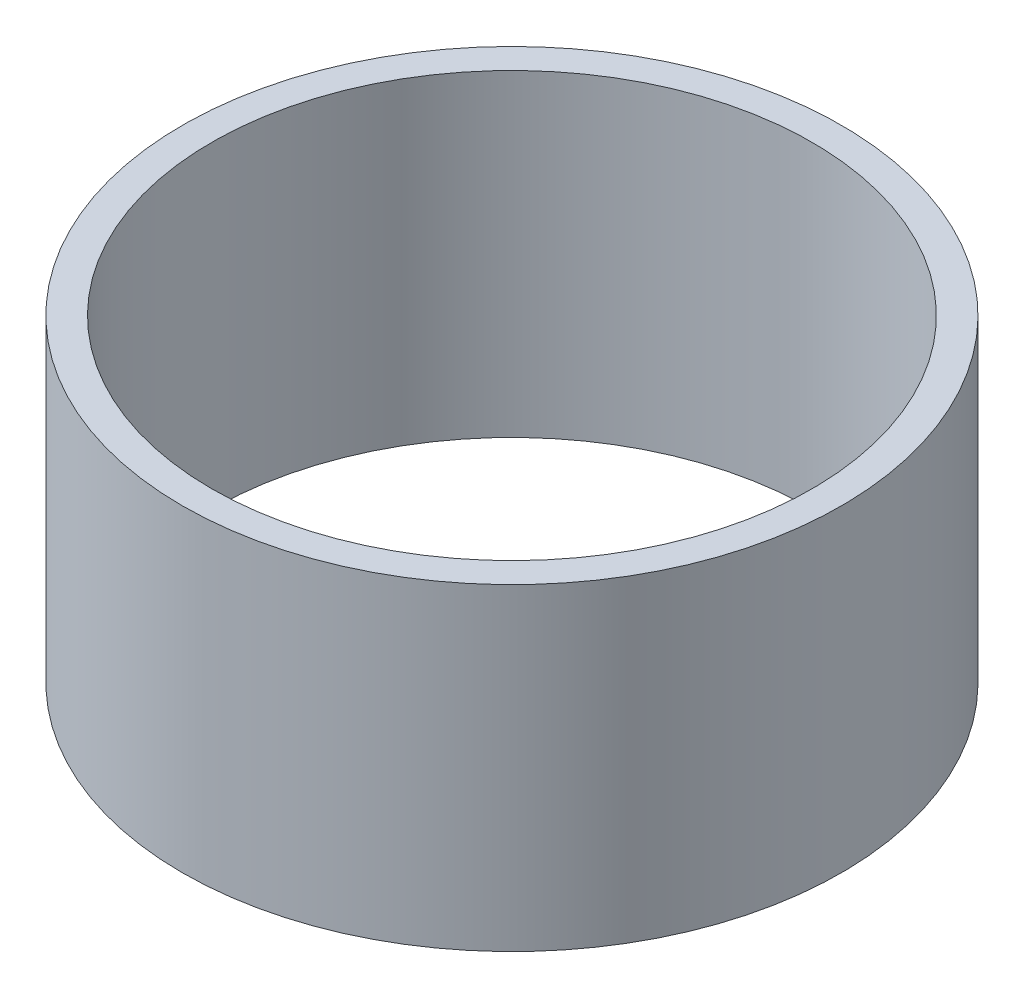
ISO-10303-21;
HEADER;
FILE_DESCRIPTION(('STEP AP214'),'2;1');
FILE_NAME('part.step','',(''),(''),'','','');
FILE_SCHEMA(('AUTOMOTIVE_DESIGN { 1 0 10303 214 1 1 1 1 }'));
ENDSEC;
DATA;
#1=APPLICATION_CONTEXT('core data for automotive mechanical design processes');
#2=APPLICATION_PROTOCOL_DEFINITION('international standard','automotive_design',2000,#1);
#3=PRODUCT_CONTEXT('',#1,'mechanical');
#4=PRODUCT('Part','Part','',(#3));
#5=PRODUCT_RELATED_PRODUCT_CATEGORY('part','',(#4));
#6=PRODUCT_DEFINITION_FORMATION('','',#4);
#7=PRODUCT_DEFINITION_CONTEXT('part definition',#1,'design');
#8=PRODUCT_DEFINITION('design','',#6,#7);
#9=PRODUCT_DEFINITION_SHAPE('','',#8);
#10=(LENGTH_UNIT() NAMED_UNIT(*) SI_UNIT(.MILLI.,.METRE.));
#11=(NAMED_UNIT(*) PLANE_ANGLE_UNIT() SI_UNIT($,.RADIAN.));
#12=(NAMED_UNIT(*) SI_UNIT($,.STERADIAN.) SOLID_ANGLE_UNIT());
#13=UNCERTAINTY_MEASURE_WITH_UNIT(LENGTH_MEASURE(1.E-05),#10,'distance_accuracy_value','');
#14=(GEOMETRIC_REPRESENTATION_CONTEXT(3) GLOBAL_UNCERTAINTY_ASSIGNED_CONTEXT((#13)) GLOBAL_UNIT_ASSIGNED_CONTEXT((#10,
#11,#12)) REPRESENTATION_CONTEXT('',''));
#15=CARTESIAN_POINT('',(0.,0.,0.));
#16=DIRECTION('',(0.,0.,1.));
#17=DIRECTION('',(1.,0.,0.));
#18=AXIS2_PLACEMENT_3D('',#15,#16,#17);
#19=CARTESIAN_POINT('',(0.,13.5,0.));
#20=DIRECTION('',(0.,1.,0.));
#21=DIRECTION('',(0.,0.,1.));
#22=AXIS2_PLACEMENT_3D('',#19,#20,#21);
#23=PLANE('',#22);
#24=CARTESIAN_POINT('',(0.,13.5,0.));
#25=DIRECTION('',(0.,1.,0.));
#26=DIRECTION('',(0.,0.,1.));
#27=AXIS2_PLACEMENT_3D('',#24,#25,#26);
#28=CIRCLE('',#27,14.);
#29=CARTESIAN_POINT('',(0.,13.5,14.));
#30=VERTEX_POINT('',#29);
#31=EDGE_CURVE('E10',#30,#30,#28,.T.);
#32=ORIENTED_EDGE('',*,*,#31,.T.);
#33=EDGE_LOOP('',(#32));
#34=FACE_BOUND('',#33,.T.);
#35=CARTESIAN_POINT('',(0.,13.5,0.));
#36=DIRECTION('',(0.,1.,0.));
#37=DIRECTION('',(0.,0.,1.));
#38=AXIS2_PLACEMENT_3D('',#35,#36,#37);
#39=CIRCLE('',#38,12.75);
#40=CARTESIAN_POINT('',(0.,13.5,12.75));
#41=VERTEX_POINT('',#40);
#42=EDGE_CURVE('E41',#41,#41,#39,.T.);
#43=ORIENTED_EDGE('',*,*,#42,.F.);
#44=EDGE_LOOP('',(#43));
#45=FACE_BOUND('',#44,.T.);
#46=ADVANCED_FACE('F30',(#34,#45),#23,.T.);
#47=CARTESIAN_POINT('',(0.,0.,0.));
#48=DIRECTION('',(0.,1.,0.));
#49=DIRECTION('',(0.,0.,1.));
#50=AXIS2_PLACEMENT_3D('',#47,#48,#49);
#51=PLANE('',#50);
#52=CARTESIAN_POINT('',(0.,0.,0.));
#53=DIRECTION('',(0.,1.,0.));
#54=DIRECTION('',(0.,0.,1.));
#55=AXIS2_PLACEMENT_3D('',#52,#53,#54);
#56=CIRCLE('',#55,14.);
#57=CARTESIAN_POINT('',(0.,0.,14.));
#58=VERTEX_POINT('',#57);
#59=EDGE_CURVE('E34',#58,#58,#56,.T.);
#60=ORIENTED_EDGE('',*,*,#59,.F.);
#61=EDGE_LOOP('',(#60));
#62=FACE_BOUND('',#61,.T.);
#63=CARTESIAN_POINT('',(0.,0.,0.));
#64=DIRECTION('',(0.,1.,0.));
#65=DIRECTION('',(0.,0.,1.));
#66=AXIS2_PLACEMENT_3D('',#63,#64,#65);
#67=CIRCLE('',#66,12.75);
#68=CARTESIAN_POINT('',(0.,0.,12.75));
#69=VERTEX_POINT('',#68);
#70=EDGE_CURVE('E43',#69,#69,#67,.T.);
#71=ORIENTED_EDGE('',*,*,#70,.T.);
#72=EDGE_LOOP('',(#71));
#73=FACE_BOUND('',#72,.T.);
#74=ADVANCED_FACE('F53',(#62,#73),#51,.F.);
#75=CARTESIAN_POINT('',(0.,13.5,0.));
#76=DIRECTION('',(0.,-1.,0.));
#77=DIRECTION('',(0.,0.,-1.));
#78=AXIS2_PLACEMENT_3D('',#75,#76,#77);
#79=CYLINDRICAL_SURFACE('',#78,14.);
#80=ORIENTED_EDGE('',*,*,#31,.F.);
#81=EDGE_LOOP('',(#80));
#82=FACE_BOUND('',#81,.T.);
#83=ORIENTED_EDGE('',*,*,#59,.T.);
#84=EDGE_LOOP('',(#83));
#85=FACE_BOUND('',#84,.T.);
#86=ADVANCED_FACE('F32',(#82,#85),#79,.T.);
#87=CARTESIAN_POINT('',(0.,13.5,0.));
#88=DIRECTION('',(0.,-1.,0.));
#89=DIRECTION('',(0.,0.,-1.));
#90=AXIS2_PLACEMENT_3D('',#87,#88,#89);
#91=CYLINDRICAL_SURFACE('',#90,12.75);
#92=ORIENTED_EDGE('',*,*,#42,.T.);
#93=EDGE_LOOP('',(#92));
#94=FACE_BOUND('',#93,.T.);
#95=ORIENTED_EDGE('',*,*,#70,.F.);
#96=EDGE_LOOP('',(#95));
#97=FACE_BOUND('',#96,.T.);
#98=ADVANCED_FACE('F49',(#94,#97),#91,.F.);
#99=CLOSED_SHELL('',(#46,#74,#86,#98));
#100=MANIFOLD_SOLID_BREP('B2',#99);
#101=ADVANCED_BREP_SHAPE_REPRESENTATION('',(#18,#100),#14);
#102=SHAPE_DEFINITION_REPRESENTATION(#9,#101);
ENDSEC;
END-ISO-10303-21;
